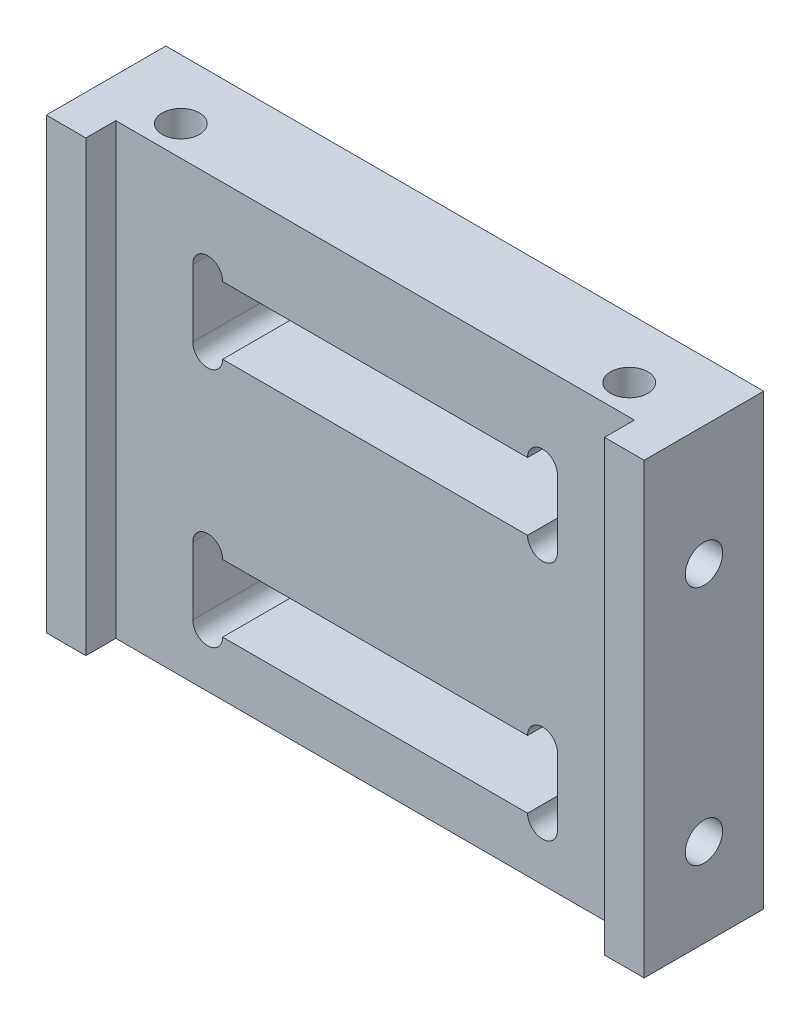
ISO-10303-21;
HEADER;
FILE_DESCRIPTION(('STEP AP214'),'2;1');
FILE_NAME('part.step','',(''),(''),'','','');
FILE_SCHEMA(('AUTOMOTIVE_DESIGN { 1 0 10303 214 1 1 1 1 }'));
ENDSEC;
DATA;
#1=APPLICATION_CONTEXT('core data for automotive mechanical design processes');
#2=APPLICATION_PROTOCOL_DEFINITION('international standard','automotive_design',2000,#1);
#3=PRODUCT_CONTEXT('',#1,'mechanical');
#4=PRODUCT('Part','Part','',(#3));
#5=PRODUCT_RELATED_PRODUCT_CATEGORY('part','',(#4));
#6=PRODUCT_DEFINITION_FORMATION('','',#4);
#7=PRODUCT_DEFINITION_CONTEXT('part definition',#1,'design');
#8=PRODUCT_DEFINITION('design','',#6,#7);
#9=PRODUCT_DEFINITION_SHAPE('','',#8);
#10=(LENGTH_UNIT() NAMED_UNIT(*) SI_UNIT(.MILLI.,.METRE.));
#11=(NAMED_UNIT(*) PLANE_ANGLE_UNIT() SI_UNIT($,.RADIAN.));
#12=(NAMED_UNIT(*) SI_UNIT($,.STERADIAN.) SOLID_ANGLE_UNIT());
#13=UNCERTAINTY_MEASURE_WITH_UNIT(LENGTH_MEASURE(1.E-05),#10,'distance_accuracy_value','');
#14=(GEOMETRIC_REPRESENTATION_CONTEXT(3) GLOBAL_UNCERTAINTY_ASSIGNED_CONTEXT((#13)) GLOBAL_UNIT_ASSIGNED_CONTEXT((#10,
#11,#12)) REPRESENTATION_CONTEXT('',''));
#15=CARTESIAN_POINT('',(0.,0.,0.));
#16=DIRECTION('',(0.,0.,1.));
#17=DIRECTION('',(1.,0.,0.));
#18=AXIS2_PLACEMENT_3D('',#15,#16,#17);
#19=CARTESIAN_POINT('',(0.,0.,4.));
#20=DIRECTION('',(0.,0.,1.));
#21=DIRECTION('',(1.,0.,0.));
#22=AXIS2_PLACEMENT_3D('',#19,#20,#21);
#23=PLANE('',#22);
#24=DIRECTION('',(0.,1.,0.));
#25=VECTOR('',#24,1.);
#26=CARTESIAN_POINT('',(17.35,19.75,4.));
#27=LINE('',#26,#25);
#28=CARTESIAN_POINT('',(17.35,-15.,4.));
#29=VERTEX_POINT('',#28);
#30=CARTESIAN_POINT('',(17.35,15.,4.));
#31=VERTEX_POINT('',#30);
#32=EDGE_CURVE('E374',#29,#31,#27,.T.);
#33=ORIENTED_EDGE('',*,*,#32,.F.);
#34=DIRECTION('',(1.,0.,0.));
#35=VECTOR('',#34,1.);
#36=CARTESIAN_POINT('',(20.,-15.,4.));
#37=LINE('',#36,#35);
#38=CARTESIAN_POINT('',(20.,-15.,4.));
#39=VERTEX_POINT('',#38);
#40=EDGE_CURVE('E513',#29,#39,#37,.T.);
#41=ORIENTED_EDGE('',*,*,#40,.T.);
#42=DIRECTION('',(0.,1.,0.));
#43=VECTOR('',#42,1.);
#44=CARTESIAN_POINT('',(20.,-15.,4.));
#45=LINE('',#44,#43);
#46=CARTESIAN_POINT('',(20.,15.,4.));
#47=VERTEX_POINT('',#46);
#48=EDGE_CURVE('E519',#39,#47,#45,.T.);
#49=ORIENTED_EDGE('',*,*,#48,.T.);
#50=DIRECTION('',(-1.,0.,0.));
#51=VECTOR('',#50,1.);
#52=CARTESIAN_POINT('',(20.,15.,4.));
#53=LINE('',#52,#51);
#54=EDGE_CURVE('E523',#47,#31,#53,.T.);
#55=ORIENTED_EDGE('',*,*,#54,.T.);
#56=EDGE_LOOP('',(#33,#41,#49,#55));
#57=FACE_BOUND('',#56,.T.);
#58=ADVANCED_FACE('F49',(#57),#23,.T.);
#59=CARTESIAN_POINT('',(-20.,-15.,4.));
#60=DIRECTION('',(1.,0.,0.));
#61=DIRECTION('',(0.,0.,-1.));
#62=AXIS2_PLACEMENT_3D('',#59,#60,#61);
#63=PLANE('',#62);
#64=CARTESIAN_POINT('',(-20.,6.99999999999999,0.));
#65=DIRECTION('',(-1.,0.,0.));
#66=DIRECTION('',(0.,0.,1.));
#67=AXIS2_PLACEMENT_3D('',#64,#65,#66);
#68=CIRCLE('',#67,1.25);
#69=CARTESIAN_POINT('',(-20.,6.99999999999999,1.25));
#70=VERTEX_POINT('',#69);
#71=EDGE_CURVE('E259',#70,#70,#68,.T.);
#72=ORIENTED_EDGE('',*,*,#71,.F.);
#73=EDGE_LOOP('',(#72));
#74=FACE_BOUND('',#73,.T.);
#75=CARTESIAN_POINT('',(-20.,-9.1,0.));
#76=DIRECTION('',(-1.,0.,0.));
#77=DIRECTION('',(0.,0.,1.));
#78=AXIS2_PLACEMENT_3D('',#75,#76,#77);
#79=CIRCLE('',#78,1.25);
#80=CARTESIAN_POINT('',(-20.,-9.1,1.25));
#81=VERTEX_POINT('',#80);
#82=EDGE_CURVE('E267',#81,#81,#79,.T.);
#83=ORIENTED_EDGE('',*,*,#82,.F.);
#84=EDGE_LOOP('',(#83));
#85=FACE_BOUND('',#84,.T.);
#86=DIRECTION('',(0.,-1.,0.));
#87=VECTOR('',#86,1.);
#88=CARTESIAN_POINT('',(-20.,-15.,-4.));
#89=LINE('',#88,#87);
#90=CARTESIAN_POINT('',(-20.,15.,-4.));
#91=VERTEX_POINT('',#90);
#92=CARTESIAN_POINT('',(-20.,-15.,-4.));
#93=VERTEX_POINT('',#92);
#94=EDGE_CURVE('E508',#91,#93,#89,.T.);
#95=ORIENTED_EDGE('',*,*,#94,.T.);
#96=DIRECTION('',(0.,0.,-1.));
#97=VECTOR('',#96,1.);
#98=CARTESIAN_POINT('',(-20.,-15.,4.));
#99=LINE('',#98,#97);
#100=CARTESIAN_POINT('',(-20.,-15.,4.));
#101=VERTEX_POINT('',#100);
#102=EDGE_CURVE('E550',#101,#93,#99,.T.);
#103=ORIENTED_EDGE('',*,*,#102,.F.);
#104=DIRECTION('',(0.,-1.,0.));
#105=VECTOR('',#104,1.);
#106=CARTESIAN_POINT('',(-20.,-15.,4.));
#107=LINE('',#106,#105);
#108=CARTESIAN_POINT('',(-20.,15.,4.));
#109=VERTEX_POINT('',#108);
#110=EDGE_CURVE('E509',#109,#101,#107,.T.);
#111=ORIENTED_EDGE('',*,*,#110,.F.);
#112=DIRECTION('',(0.,0.,-1.));
#113=VECTOR('',#112,1.);
#114=CARTESIAN_POINT('',(-20.,15.,4.));
#115=LINE('',#114,#113);
#116=EDGE_CURVE('E527',#109,#91,#115,.T.);
#117=ORIENTED_EDGE('',*,*,#116,.T.);
#118=EDGE_LOOP('',(#95,#103,#111,#117));
#119=FACE_BOUND('',#118,.T.);
#120=ADVANCED_FACE('F51',(#74,#85,#119),#63,.F.);
#121=CARTESIAN_POINT('',(20.,-15.,4.));
#122=DIRECTION('',(0.,1.,0.));
#123=DIRECTION('',(-1.,0.,0.));
#124=AXIS2_PLACEMENT_3D('',#121,#122,#123);
#125=PLANE('',#124);
#126=CARTESIAN_POINT('',(14.5,-15.,0.));
#127=DIRECTION('',(0.,-1.,0.));
#128=DIRECTION('',(0.,0.,-1.));
#129=AXIS2_PLACEMENT_3D('',#126,#127,#128);
#130=CIRCLE('',#129,1.25);
#131=CARTESIAN_POINT('',(14.5,-15.,-1.25));
#132=VERTEX_POINT('',#131);
#133=EDGE_CURVE('E291',#132,#132,#130,.T.);
#134=ORIENTED_EDGE('',*,*,#133,.F.);
#135=EDGE_LOOP('',(#134));
#136=FACE_BOUND('',#135,.T.);
#137=CARTESIAN_POINT('',(-14.5,-15.,0.));
#138=DIRECTION('',(0.,-1.,0.));
#139=DIRECTION('',(0.,0.,-1.));
#140=AXIS2_PLACEMENT_3D('',#137,#138,#139);
#141=CIRCLE('',#140,1.25);
#142=CARTESIAN_POINT('',(-14.5,-15.,-1.25));
#143=VERTEX_POINT('',#142);
#144=EDGE_CURVE('E299',#143,#143,#141,.T.);
#145=ORIENTED_EDGE('',*,*,#144,.F.);
#146=EDGE_LOOP('',(#145));
#147=FACE_BOUND('',#146,.T.);
#148=ORIENTED_EDGE('',*,*,#40,.F.);
#149=DIRECTION('',(0.,0.,1.));
#150=VECTOR('',#149,1.);
#151=CARTESIAN_POINT('',(17.35,-15.,2.));
#152=LINE('',#151,#150);
#153=CARTESIAN_POINT('',(17.35,-15.,2.));
#154=VERTEX_POINT('',#153);
#155=EDGE_CURVE('E494',#154,#29,#152,.T.);
#156=ORIENTED_EDGE('',*,*,#155,.F.);
#157=DIRECTION('',(1.,0.,0.));
#158=VECTOR('',#157,1.);
#159=CARTESIAN_POINT('',(-17.35,-15.,2.));
#160=LINE('',#159,#158);
#161=CARTESIAN_POINT('',(-17.35,-15.,2.));
#162=VERTEX_POINT('',#161);
#163=EDGE_CURVE('E483',#162,#154,#160,.T.);
#164=ORIENTED_EDGE('',*,*,#163,.F.);
#165=DIRECTION('',(0.,0.,1.));
#166=VECTOR('',#165,1.);
#167=CARTESIAN_POINT('',(-17.35,-15.,2.));
#168=LINE('',#167,#166);
#169=CARTESIAN_POINT('',(-17.35,-15.,4.));
#170=VERTEX_POINT('',#169);
#171=EDGE_CURVE('E491',#162,#170,#168,.T.);
#172=ORIENTED_EDGE('',*,*,#171,.T.);
#173=EDGE_CURVE('E515',#101,#170,#37,.T.);
#174=ORIENTED_EDGE('',*,*,#173,.F.);
#175=ORIENTED_EDGE('',*,*,#102,.T.);
#176=DIRECTION('',(1.,0.,0.));
#177=VECTOR('',#176,1.);
#178=CARTESIAN_POINT('',(20.,-15.,-4.));
#179=LINE('',#178,#177);
#180=CARTESIAN_POINT('',(20.,-15.,-4.));
#181=VERTEX_POINT('',#180);
#182=EDGE_CURVE('E531',#93,#181,#179,.T.);
#183=ORIENTED_EDGE('',*,*,#182,.T.);
#184=DIRECTION('',(0.,0.,-1.));
#185=VECTOR('',#184,1.);
#186=CARTESIAN_POINT('',(20.,-15.,4.));
#187=LINE('',#186,#185);
#188=EDGE_CURVE('E546',#39,#181,#187,.T.);
#189=ORIENTED_EDGE('',*,*,#188,.F.);
#190=EDGE_LOOP('',(#148,#156,#164,#172,#174,#175,#183,#189));
#191=FACE_BOUND('',#190,.T.);
#192=ADVANCED_FACE('F565',(#136,#147,#191),#125,.F.);
#193=CARTESIAN_POINT('',(20.,-15.,4.));
#194=DIRECTION('',(-1.,0.,0.));
#195=DIRECTION('',(0.,0.,1.));
#196=AXIS2_PLACEMENT_3D('',#193,#194,#195);
#197=PLANE('',#196);
#198=CARTESIAN_POINT('',(20.,6.99999999999999,0.));
#199=DIRECTION('',(1.,0.,0.));
#200=DIRECTION('',(0.,0.,-1.));
#201=AXIS2_PLACEMENT_3D('',#198,#199,#200);
#202=CIRCLE('',#201,1.25);
#203=CARTESIAN_POINT('',(20.,6.99999999999999,-1.25));
#204=VERTEX_POINT('',#203);
#205=EDGE_CURVE('E275',#204,#204,#202,.T.);
#206=ORIENTED_EDGE('',*,*,#205,.F.);
#207=EDGE_LOOP('',(#206));
#208=FACE_BOUND('',#207,.T.);
#209=CARTESIAN_POINT('',(20.,-9.1,0.));
#210=DIRECTION('',(1.,0.,0.));
#211=DIRECTION('',(0.,0.,-1.));
#212=AXIS2_PLACEMENT_3D('',#209,#210,#211);
#213=CIRCLE('',#212,1.25);
#214=CARTESIAN_POINT('',(20.,-9.1,-1.25));
#215=VERTEX_POINT('',#214);
#216=EDGE_CURVE('E283',#215,#215,#213,.T.);
#217=ORIENTED_EDGE('',*,*,#216,.F.);
#218=EDGE_LOOP('',(#217));
#219=FACE_BOUND('',#218,.T.);
#220=DIRECTION('',(0.,1.,0.));
#221=VECTOR('',#220,1.);
#222=CARTESIAN_POINT('',(20.,-15.,-4.));
#223=LINE('',#222,#221);
#224=CARTESIAN_POINT('',(20.,15.,-4.));
#225=VERTEX_POINT('',#224);
#226=EDGE_CURVE('E534',#181,#225,#223,.T.);
#227=ORIENTED_EDGE('',*,*,#226,.T.);
#228=DIRECTION('',(0.,0.,-1.));
#229=VECTOR('',#228,1.);
#230=CARTESIAN_POINT('',(20.,15.,4.));
#231=LINE('',#230,#229);
#232=EDGE_CURVE('E542',#47,#225,#231,.T.);
#233=ORIENTED_EDGE('',*,*,#232,.F.);
#234=ORIENTED_EDGE('',*,*,#48,.F.);
#235=ORIENTED_EDGE('',*,*,#188,.T.);
#236=EDGE_LOOP('',(#227,#233,#234,#235));
#237=FACE_BOUND('',#236,.T.);
#238=ADVANCED_FACE('F578',(#208,#219,#237),#197,.F.);
#239=CARTESIAN_POINT('',(20.,15.,4.));
#240=DIRECTION('',(0.,-1.,0.));
#241=DIRECTION('',(1.,0.,0.));
#242=AXIS2_PLACEMENT_3D('',#239,#240,#241);
#243=PLANE('',#242);
#244=CARTESIAN_POINT('',(-15.,15.,0.));
#245=DIRECTION('',(0.,1.,0.));
#246=DIRECTION('',(0.,0.,1.));
#247=AXIS2_PLACEMENT_3D('',#244,#245,#246);
#248=CIRCLE('',#247,1.24999999999999);
#249=CARTESIAN_POINT('',(-15.,15.,1.24999999999999));
#250=VERTEX_POINT('',#249);
#251=EDGE_CURVE('E245',#250,#250,#248,.T.);
#252=ORIENTED_EDGE('',*,*,#251,.F.);
#253=EDGE_LOOP('',(#252));
#254=FACE_BOUND('',#253,.T.);
#255=CARTESIAN_POINT('',(15.,15.,0.));
#256=DIRECTION('',(0.,1.,0.));
#257=DIRECTION('',(0.,0.,1.));
#258=AXIS2_PLACEMENT_3D('',#255,#256,#257);
#259=CIRCLE('',#258,1.24999999999999);
#260=CARTESIAN_POINT('',(15.,15.,1.24999999999999));
#261=VERTEX_POINT('',#260);
#262=EDGE_CURVE('E244',#261,#261,#259,.T.);
#263=ORIENTED_EDGE('',*,*,#262,.F.);
#264=EDGE_LOOP('',(#263));
#265=FACE_BOUND('',#264,.T.);
#266=DIRECTION('',(1.,0.,0.));
#267=VECTOR('',#266,1.);
#268=CARTESIAN_POINT('',(20.,15.,2.));
#269=LINE('',#268,#267);
#270=CARTESIAN_POINT('',(-17.35,15.,2.));
#271=VERTEX_POINT('',#270);
#272=CARTESIAN_POINT('',(17.35,15.,2.));
#273=VERTEX_POINT('',#272);
#274=EDGE_CURVE('E11',#271,#273,#269,.T.);
#275=ORIENTED_EDGE('',*,*,#274,.T.);
#276=DIRECTION('',(0.,0.,1.));
#277=VECTOR('',#276,1.);
#278=CARTESIAN_POINT('',(17.35,15.,4.));
#279=LINE('',#278,#277);
#280=EDGE_CURVE('E504',#273,#31,#279,.T.);
#281=ORIENTED_EDGE('',*,*,#280,.T.);
#282=ORIENTED_EDGE('',*,*,#54,.F.);
#283=ORIENTED_EDGE('',*,*,#232,.T.);
#284=DIRECTION('',(-1.,0.,0.));
#285=VECTOR('',#284,1.);
#286=CARTESIAN_POINT('',(20.,15.,-4.));
#287=LINE('',#286,#285);
#288=EDGE_CURVE('E514',#225,#91,#287,.T.);
#289=ORIENTED_EDGE('',*,*,#288,.T.);
#290=ORIENTED_EDGE('',*,*,#116,.F.);
#291=CARTESIAN_POINT('',(-17.35,15.,4.));
#292=VERTEX_POINT('',#291);
#293=EDGE_CURVE('E522',#292,#109,#53,.T.);
#294=ORIENTED_EDGE('',*,*,#293,.F.);
#295=DIRECTION('',(0.,0.,-1.));
#296=VECTOR('',#295,1.);
#297=CARTESIAN_POINT('',(-17.35,15.,4.));
#298=LINE('',#297,#296);
#299=EDGE_CURVE('E497',#292,#271,#298,.T.);
#300=ORIENTED_EDGE('',*,*,#299,.T.);
#301=EDGE_LOOP('',(#275,#281,#282,#283,#289,#290,#294,#300));
#302=FACE_BOUND('',#301,.T.);
#303=ADVANCED_FACE('F583',(#254,#265,#302),#243,.F.);
#304=DIRECTION('',(0.,-1.,0.));
#305=VECTOR('',#304,1.);
#306=CARTESIAN_POINT('',(-17.35,0.,4.));
#307=LINE('',#306,#305);
#308=EDGE_CURVE('E58',#292,#170,#307,.T.);
#309=ORIENTED_EDGE('',*,*,#308,.F.);
#310=ORIENTED_EDGE('',*,*,#293,.T.);
#311=ORIENTED_EDGE('',*,*,#110,.T.);
#312=ORIENTED_EDGE('',*,*,#173,.T.);
#313=EDGE_LOOP('',(#309,#310,#311,#312));
#314=FACE_BOUND('',#313,.T.);
#315=ADVANCED_FACE('F567',(#314),#23,.T.);
#316=CARTESIAN_POINT('',(0.,0.,-4.));
#317=DIRECTION('',(0.,0.,1.));
#318=DIRECTION('',(1.,0.,0.));
#319=AXIS2_PLACEMENT_3D('',#316,#317,#318);
#320=PLANE('',#319);
#321=DIRECTION('',(0.,1.,0.));
#322=VECTOR('',#321,1.);
#323=CARTESIAN_POINT('',(12.2,-6.85,-4.));
#324=LINE('',#323,#322);
#325=CARTESIAN_POINT('',(12.2,-11.35,-4.));
#326=VERTEX_POINT('',#325);
#327=CARTESIAN_POINT('',(12.2,-6.85,-4.));
#328=VERTEX_POINT('',#327);
#329=EDGE_CURVE('E335',#326,#328,#324,.T.);
#330=ORIENTED_EDGE('',*,*,#329,.T.);
#331=CARTESIAN_POINT('',(11.2,-6.85,-4.));
#332=DIRECTION('',(0.,0.,1.));
#333=DIRECTION('',(1.,0.,0.));
#334=AXIS2_PLACEMENT_3D('',#331,#332,#333);
#335=CIRCLE('',#334,0.999999999999997);
#336=CARTESIAN_POINT('',(10.2,-6.85,-4.));
#337=VERTEX_POINT('',#336);
#338=EDGE_CURVE('E308',#328,#337,#335,.T.);
#339=ORIENTED_EDGE('',*,*,#338,.T.);
#340=DIRECTION('',(-1.,0.,0.));
#341=VECTOR('',#340,1.);
#342=CARTESIAN_POINT('',(-10.2,-6.85,-4.));
#343=LINE('',#342,#341);
#344=CARTESIAN_POINT('',(-10.2,-6.85,-4.));
#345=VERTEX_POINT('',#344);
#346=EDGE_CURVE('E312',#337,#345,#343,.T.);
#347=ORIENTED_EDGE('',*,*,#346,.T.);
#348=CARTESIAN_POINT('',(-11.2,-6.85,-4.));
#349=DIRECTION('',(0.,0.,1.));
#350=DIRECTION('',(-1.,0.,0.));
#351=AXIS2_PLACEMENT_3D('',#348,#349,#350);
#352=CIRCLE('',#351,1.);
#353=CARTESIAN_POINT('',(-12.2,-6.85,-4.));
#354=VERTEX_POINT('',#353);
#355=EDGE_CURVE('E65',#345,#354,#352,.T.);
#356=ORIENTED_EDGE('',*,*,#355,.T.);
#357=DIRECTION('',(0.,-1.,0.));
#358=VECTOR('',#357,1.);
#359=CARTESIAN_POINT('',(-12.2,-11.35,-4.));
#360=LINE('',#359,#358);
#361=CARTESIAN_POINT('',(-12.2,-11.35,-4.));
#362=VERTEX_POINT('',#361);
#363=EDGE_CURVE('E319',#354,#362,#360,.T.);
#364=ORIENTED_EDGE('',*,*,#363,.T.);
#365=CARTESIAN_POINT('',(-11.2,-11.35,-4.));
#366=DIRECTION('',(0.,0.,1.));
#367=DIRECTION('',(1.,0.,0.));
#368=AXIS2_PLACEMENT_3D('',#365,#366,#367);
#369=CIRCLE('',#368,1.);
#370=CARTESIAN_POINT('',(-10.2,-11.35,-4.));
#371=VERTEX_POINT('',#370);
#372=EDGE_CURVE('E323',#362,#371,#369,.T.);
#373=ORIENTED_EDGE('',*,*,#372,.T.);
#374=DIRECTION('',(1.,0.,0.));
#375=VECTOR('',#374,1.);
#376=CARTESIAN_POINT('',(10.2,-11.35,-4.));
#377=LINE('',#376,#375);
#378=CARTESIAN_POINT('',(10.2,-11.35,-4.));
#379=VERTEX_POINT('',#378);
#380=EDGE_CURVE('E327',#371,#379,#377,.T.);
#381=ORIENTED_EDGE('',*,*,#380,.T.);
#382=CARTESIAN_POINT('',(11.2,-11.35,-4.));
#383=DIRECTION('',(0.,0.,1.));
#384=DIRECTION('',(1.,0.,0.));
#385=AXIS2_PLACEMENT_3D('',#382,#383,#384);
#386=CIRCLE('',#385,0.999999999999999);
#387=EDGE_CURVE('E331',#379,#326,#386,.T.);
#388=ORIENTED_EDGE('',*,*,#387,.T.);
#389=EDGE_LOOP('',(#330,#339,#347,#356,#364,#373,#381,#388));
#390=FACE_BOUND('',#389,.T.);
#391=DIRECTION('',(0.,1.,0.));
#392=VECTOR('',#391,1.);
#393=CARTESIAN_POINT('',(12.2,9.25,-4.));
#394=LINE('',#393,#392);
#395=CARTESIAN_POINT('',(12.2,4.75,-4.));
#396=VERTEX_POINT('',#395);
#397=CARTESIAN_POINT('',(12.2,9.25,-4.));
#398=VERTEX_POINT('',#397);
#399=EDGE_CURVE('E400',#396,#398,#394,.T.);
#400=ORIENTED_EDGE('',*,*,#399,.T.);
#401=CARTESIAN_POINT('',(11.2,9.25,-4.));
#402=DIRECTION('',(0.,0.,1.));
#403=DIRECTION('',(1.,0.,0.));
#404=AXIS2_PLACEMENT_3D('',#401,#402,#403);
#405=CIRCLE('',#404,1.);
#406=CARTESIAN_POINT('',(10.2,9.24999999999999,-4.));
#407=VERTEX_POINT('',#406);
#408=EDGE_CURVE('E426',#398,#407,#405,.T.);
#409=ORIENTED_EDGE('',*,*,#408,.T.);
#410=DIRECTION('',(-1.,0.,0.));
#411=VECTOR('',#410,1.);
#412=CARTESIAN_POINT('',(-10.2,9.25,-4.));
#413=LINE('',#412,#411);
#414=CARTESIAN_POINT('',(-10.2,9.25,-4.));
#415=VERTEX_POINT('',#414);
#416=EDGE_CURVE('E473',#407,#415,#413,.T.);
#417=ORIENTED_EDGE('',*,*,#416,.T.);
#418=CARTESIAN_POINT('',(-11.2,9.25,-4.));
#419=DIRECTION('',(0.,0.,1.));
#420=DIRECTION('',(-1.,0.,0.));
#421=AXIS2_PLACEMENT_3D('',#418,#419,#420);
#422=CIRCLE('',#421,1.);
#423=CARTESIAN_POINT('',(-12.2,9.25,-4.));
#424=VERTEX_POINT('',#423);
#425=EDGE_CURVE('E73',#415,#424,#422,.T.);
#426=ORIENTED_EDGE('',*,*,#425,.T.);
#427=DIRECTION('',(0.,-1.,0.));
#428=VECTOR('',#427,1.);
#429=CARTESIAN_POINT('',(-12.2,4.75,-4.));
#430=LINE('',#429,#428);
#431=CARTESIAN_POINT('',(-12.2,4.75,-4.));
#432=VERTEX_POINT('',#431);
#433=EDGE_CURVE('E467',#424,#432,#430,.T.);
#434=ORIENTED_EDGE('',*,*,#433,.T.);
#435=CARTESIAN_POINT('',(-11.2,4.75,-4.));
#436=DIRECTION('',(0.,0.,1.));
#437=DIRECTION('',(1.,0.,0.));
#438=AXIS2_PLACEMENT_3D('',#435,#436,#437);
#439=CIRCLE('',#438,1.);
#440=CARTESIAN_POINT('',(-10.2,4.75,-4.));
#441=VERTEX_POINT('',#440);
#442=EDGE_CURVE('E463',#432,#441,#439,.T.);
#443=ORIENTED_EDGE('',*,*,#442,.T.);
#444=DIRECTION('',(1.,0.,0.));
#445=VECTOR('',#444,1.);
#446=CARTESIAN_POINT('',(10.2,4.75,-4.));
#447=LINE('',#446,#445);
#448=CARTESIAN_POINT('',(10.2,4.75,-4.));
#449=VERTEX_POINT('',#448);
#450=EDGE_CURVE('E459',#441,#449,#447,.T.);
#451=ORIENTED_EDGE('',*,*,#450,.T.);
#452=CARTESIAN_POINT('',(11.2,4.75,-4.));
#453=DIRECTION('',(0.,0.,1.));
#454=DIRECTION('',(1.,0.,0.));
#455=AXIS2_PLACEMENT_3D('',#452,#453,#454);
#456=CIRCLE('',#455,1.);
#457=EDGE_CURVE('E455',#449,#396,#456,.T.);
#458=ORIENTED_EDGE('',*,*,#457,.T.);
#459=EDGE_LOOP('',(#400,#409,#417,#426,#434,#443,#451,#458));
#460=FACE_BOUND('',#459,.T.);
#461=ORIENTED_EDGE('',*,*,#94,.F.);
#462=ORIENTED_EDGE('',*,*,#288,.F.);
#463=ORIENTED_EDGE('',*,*,#226,.F.);
#464=ORIENTED_EDGE('',*,*,#182,.F.);
#465=EDGE_LOOP('',(#461,#462,#463,#464));
#466=FACE_BOUND('',#465,.T.);
#467=ADVANCED_FACE('F581',(#390,#460,#466),#320,.F.);
#468=CARTESIAN_POINT('',(15.85,19.75,2.));
#469=DIRECTION('',(0.,0.,-1.));
#470=DIRECTION('',(-1.,0.,0.));
#471=AXIS2_PLACEMENT_3D('',#468,#469,#470);
#472=PLANE('',#471);
#473=DIRECTION('',(-1.,0.,0.));
#474=VECTOR('',#473,1.);
#475=CARTESIAN_POINT('',(-10.2,-6.85,2.));
#476=LINE('',#475,#474);
#477=CARTESIAN_POINT('',(10.2,-6.85,2.));
#478=VERTEX_POINT('',#477);
#479=CARTESIAN_POINT('',(-10.2,-6.85,2.));
#480=VERTEX_POINT('',#479);
#481=EDGE_CURVE('E343',#478,#480,#476,.T.);
#482=ORIENTED_EDGE('',*,*,#481,.F.);
#483=CARTESIAN_POINT('',(11.2,-6.85,2.));
#484=DIRECTION('',(0.,0.,1.));
#485=DIRECTION('',(1.,0.,0.));
#486=AXIS2_PLACEMENT_3D('',#483,#484,#485);
#487=CIRCLE('',#486,0.999999999999997);
#488=CARTESIAN_POINT('',(12.2,-6.85,2.));
#489=VERTEX_POINT('',#488);
#490=EDGE_CURVE('E340',#489,#478,#487,.T.);
#491=ORIENTED_EDGE('',*,*,#490,.F.);
#492=DIRECTION('',(0.,1.,0.));
#493=VECTOR('',#492,1.);
#494=CARTESIAN_POINT('',(12.2,-6.85,2.));
#495=LINE('',#494,#493);
#496=CARTESIAN_POINT('',(12.2,-11.35,2.));
#497=VERTEX_POINT('',#496);
#498=EDGE_CURVE('E313',#497,#489,#495,.T.);
#499=ORIENTED_EDGE('',*,*,#498,.F.);
#500=CARTESIAN_POINT('',(11.2,-11.35,2.));
#501=DIRECTION('',(0.,0.,1.));
#502=DIRECTION('',(1.,0.,0.));
#503=AXIS2_PLACEMENT_3D('',#500,#501,#502);
#504=CIRCLE('',#503,0.999999999999999);
#505=CARTESIAN_POINT('',(10.2,-11.35,2.));
#506=VERTEX_POINT('',#505);
#507=EDGE_CURVE('E364',#506,#497,#504,.T.);
#508=ORIENTED_EDGE('',*,*,#507,.F.);
#509=DIRECTION('',(1.,0.,0.));
#510=VECTOR('',#509,1.);
#511=CARTESIAN_POINT('',(10.2,-11.35,2.));
#512=LINE('',#511,#510);
#513=CARTESIAN_POINT('',(-10.2,-11.35,2.));
#514=VERTEX_POINT('',#513);
#515=EDGE_CURVE('E360',#514,#506,#512,.T.);
#516=ORIENTED_EDGE('',*,*,#515,.F.);
#517=CARTESIAN_POINT('',(-11.2,-11.35,2.));
#518=DIRECTION('',(0.,0.,1.));
#519=DIRECTION('',(1.,0.,0.));
#520=AXIS2_PLACEMENT_3D('',#517,#518,#519);
#521=CIRCLE('',#520,1.);
#522=CARTESIAN_POINT('',(-12.2,-11.35,2.));
#523=VERTEX_POINT('',#522);
#524=EDGE_CURVE('E356',#523,#514,#521,.T.);
#525=ORIENTED_EDGE('',*,*,#524,.F.);
#526=DIRECTION('',(0.,-1.,0.));
#527=VECTOR('',#526,1.);
#528=CARTESIAN_POINT('',(-12.2,-11.35,2.));
#529=LINE('',#528,#527);
#530=CARTESIAN_POINT('',(-12.2,-6.85,2.));
#531=VERTEX_POINT('',#530);
#532=EDGE_CURVE('E352',#531,#523,#529,.T.);
#533=ORIENTED_EDGE('',*,*,#532,.F.);
#534=CARTESIAN_POINT('',(-11.2,-6.85,2.));
#535=DIRECTION('',(0.,0.,1.));
#536=DIRECTION('',(-1.,0.,0.));
#537=AXIS2_PLACEMENT_3D('',#534,#535,#536);
#538=CIRCLE('',#537,1.);
#539=EDGE_CURVE('E348',#480,#531,#538,.T.);
#540=ORIENTED_EDGE('',*,*,#539,.F.);
#541=EDGE_LOOP('',(#482,#491,#499,#508,#516,#525,#533,#540));
#542=FACE_BOUND('',#541,.T.);
#543=DIRECTION('',(-1.,0.,0.));
#544=VECTOR('',#543,1.);
#545=CARTESIAN_POINT('',(-10.2,9.25,2.));
#546=LINE('',#545,#544);
#547=CARTESIAN_POINT('',(10.2,9.24999999999999,2.));
#548=VERTEX_POINT('',#547);
#549=CARTESIAN_POINT('',(-10.2,9.25,2.));
#550=VERTEX_POINT('',#549);
#551=EDGE_CURVE('E446',#548,#550,#546,.T.);
#552=ORIENTED_EDGE('',*,*,#551,.F.);
#553=CARTESIAN_POINT('',(11.2,9.25,2.));
#554=DIRECTION('',(0.,0.,1.));
#555=DIRECTION('',(1.,0.,0.));
#556=AXIS2_PLACEMENT_3D('',#553,#554,#555);
#557=CIRCLE('',#556,1.);
#558=CARTESIAN_POINT('',(12.2,9.25,2.));
#559=VERTEX_POINT('',#558);
#560=EDGE_CURVE('E344',#559,#548,#557,.T.);
#561=ORIENTED_EDGE('',*,*,#560,.F.);
#562=DIRECTION('',(0.,1.,0.));
#563=VECTOR('',#562,1.);
#564=CARTESIAN_POINT('',(12.2,9.25,2.));
#565=LINE('',#564,#563);
#566=CARTESIAN_POINT('',(12.2,4.75,2.));
#567=VERTEX_POINT('',#566);
#568=EDGE_CURVE('E421',#567,#559,#565,.T.);
#569=ORIENTED_EDGE('',*,*,#568,.F.);
#570=CARTESIAN_POINT('',(11.2,4.75,2.));
#571=DIRECTION('',(0.,0.,1.));
#572=DIRECTION('',(1.,0.,0.));
#573=AXIS2_PLACEMENT_3D('',#570,#571,#572);
#574=CIRCLE('',#573,1.);
#575=CARTESIAN_POINT('',(10.2,4.75,2.));
#576=VERTEX_POINT('',#575);
#577=EDGE_CURVE('E425',#576,#567,#574,.T.);
#578=ORIENTED_EDGE('',*,*,#577,.F.);
#579=DIRECTION('',(1.,0.,0.));
#580=VECTOR('',#579,1.);
#581=CARTESIAN_POINT('',(10.2,4.75,2.));
#582=LINE('',#581,#580);
#583=CARTESIAN_POINT('',(-10.2,4.75,2.));
#584=VERTEX_POINT('',#583);
#585=EDGE_CURVE('E430',#584,#576,#582,.T.);
#586=ORIENTED_EDGE('',*,*,#585,.F.);
#587=CARTESIAN_POINT('',(-11.2,4.75,2.));
#588=DIRECTION('',(0.,0.,1.));
#589=DIRECTION('',(1.,0.,0.));
#590=AXIS2_PLACEMENT_3D('',#587,#588,#589);
#591=CIRCLE('',#590,1.);
#592=CARTESIAN_POINT('',(-12.2,4.75,2.));
#593=VERTEX_POINT('',#592);
#594=EDGE_CURVE('E434',#593,#584,#591,.T.);
#595=ORIENTED_EDGE('',*,*,#594,.F.);
#596=DIRECTION('',(0.,-1.,0.));
#597=VECTOR('',#596,1.);
#598=CARTESIAN_POINT('',(-12.2,4.75,2.));
#599=LINE('',#598,#597);
#600=CARTESIAN_POINT('',(-12.2,9.25,2.));
#601=VERTEX_POINT('',#600);
#602=EDGE_CURVE('E438',#601,#593,#599,.T.);
#603=ORIENTED_EDGE('',*,*,#602,.F.);
#604=CARTESIAN_POINT('',(-11.2,9.25,2.));
#605=DIRECTION('',(0.,0.,1.));
#606=DIRECTION('',(-1.,0.,0.));
#607=AXIS2_PLACEMENT_3D('',#604,#605,#606);
#608=CIRCLE('',#607,1.);
#609=EDGE_CURVE('E442',#550,#601,#608,.T.);
#610=ORIENTED_EDGE('',*,*,#609,.F.);
#611=EDGE_LOOP('',(#552,#561,#569,#578,#586,#595,#603,#610));
#612=FACE_BOUND('',#611,.T.);
#613=DIRECTION('',(0.,-1.,0.));
#614=VECTOR('',#613,1.);
#615=CARTESIAN_POINT('',(-17.35,19.75,2.));
#616=LINE('',#615,#614);
#617=EDGE_CURVE('E480',#271,#162,#616,.T.);
#618=ORIENTED_EDGE('',*,*,#617,.T.);
#619=ORIENTED_EDGE('',*,*,#163,.T.);
#620=DIRECTION('',(0.,1.,0.));
#621=VECTOR('',#620,1.);
#622=CARTESIAN_POINT('',(17.35,-15.,2.));
#623=LINE('',#622,#621);
#624=EDGE_CURVE('E487',#154,#273,#623,.T.);
#625=ORIENTED_EDGE('',*,*,#624,.T.);
#626=ORIENTED_EDGE('',*,*,#274,.F.);
#627=EDGE_LOOP('',(#618,#619,#625,#626));
#628=FACE_BOUND('',#627,.T.);
#629=ADVANCED_FACE('F616',(#542,#612,#628),#472,.F.);
#630=CARTESIAN_POINT('',(17.35,19.75,2.));
#631=DIRECTION('',(1.,0.,0.));
#632=DIRECTION('',(0.,0.,-1.));
#633=AXIS2_PLACEMENT_3D('',#630,#631,#632);
#634=PLANE('',#633);
#635=ORIENTED_EDGE('',*,*,#624,.F.);
#636=ORIENTED_EDGE('',*,*,#155,.T.);
#637=ORIENTED_EDGE('',*,*,#32,.T.);
#638=ORIENTED_EDGE('',*,*,#280,.F.);
#639=EDGE_LOOP('',(#635,#636,#637,#638));
#640=FACE_BOUND('',#639,.T.);
#641=ADVANCED_FACE('F614',(#640),#634,.F.);
#642=CARTESIAN_POINT('',(-17.35,-13.2,2.));
#643=DIRECTION('',(-1.,0.,0.));
#644=DIRECTION('',(0.,0.,1.));
#645=AXIS2_PLACEMENT_3D('',#642,#643,#644);
#646=PLANE('',#645);
#647=ORIENTED_EDGE('',*,*,#308,.T.);
#648=ORIENTED_EDGE('',*,*,#171,.F.);
#649=ORIENTED_EDGE('',*,*,#617,.F.);
#650=ORIENTED_EDGE('',*,*,#299,.F.);
#651=EDGE_LOOP('',(#647,#648,#649,#650));
#652=FACE_BOUND('',#651,.T.);
#653=ADVANCED_FACE('F558',(#652),#646,.F.);
#654=CARTESIAN_POINT('',(11.2,9.25,-4.));
#655=DIRECTION('',(0.,0.,1.));
#656=DIRECTION('',(1.,0.,0.));
#657=AXIS2_PLACEMENT_3D('',#654,#655,#656);
#658=CYLINDRICAL_SURFACE('',#657,1.);
#659=ORIENTED_EDGE('',*,*,#560,.T.);
#660=DIRECTION('',(0.,0.,1.));
#661=VECTOR('',#660,1.);
#662=CARTESIAN_POINT('',(10.2,9.24999999999999,-4.));
#663=LINE('',#662,#661);
#664=EDGE_CURVE('E396',#407,#548,#663,.T.);
#665=ORIENTED_EDGE('',*,*,#664,.F.);
#666=ORIENTED_EDGE('',*,*,#408,.F.);
#667=DIRECTION('',(0.,0.,1.));
#668=VECTOR('',#667,1.);
#669=CARTESIAN_POINT('',(12.2,9.25,-4.));
#670=LINE('',#669,#668);
#671=EDGE_CURVE('E307',#398,#559,#670,.T.);
#672=ORIENTED_EDGE('',*,*,#671,.T.);
#673=EDGE_LOOP('',(#659,#665,#666,#672));
#674=FACE_BOUND('',#673,.T.);
#675=ADVANCED_FACE('F708',(#674),#658,.F.);
#676=CARTESIAN_POINT('',(12.2,9.25,-4.));
#677=DIRECTION('',(1.,0.,0.));
#678=DIRECTION('',(0.,0.,-1.));
#679=AXIS2_PLACEMENT_3D('',#676,#677,#678);
#680=PLANE('',#679);
#681=ORIENTED_EDGE('',*,*,#568,.T.);
#682=ORIENTED_EDGE('',*,*,#671,.F.);
#683=ORIENTED_EDGE('',*,*,#399,.F.);
#684=DIRECTION('',(0.,0.,1.));
#685=VECTOR('',#684,1.);
#686=CARTESIAN_POINT('',(12.2,4.75,-4.));
#687=LINE('',#686,#685);
#688=EDGE_CURVE('E416',#396,#567,#687,.T.);
#689=ORIENTED_EDGE('',*,*,#688,.T.);
#690=EDGE_LOOP('',(#681,#682,#683,#689));
#691=FACE_BOUND('',#690,.T.);
#692=ADVANCED_FACE('F711',(#691),#680,.F.);
#693=CARTESIAN_POINT('',(11.2,4.75,-4.));
#694=DIRECTION('',(0.,0.,1.));
#695=DIRECTION('',(1.,0.,0.));
#696=AXIS2_PLACEMENT_3D('',#693,#694,#695);
#697=CYLINDRICAL_SURFACE('',#696,1.);
#698=ORIENTED_EDGE('',*,*,#577,.T.);
#699=ORIENTED_EDGE('',*,*,#688,.F.);
#700=ORIENTED_EDGE('',*,*,#457,.F.);
#701=DIRECTION('',(0.,0.,1.));
#702=VECTOR('',#701,1.);
#703=CARTESIAN_POINT('',(10.2,4.75,-4.));
#704=LINE('',#703,#702);
#705=EDGE_CURVE('E413',#449,#576,#704,.T.);
#706=ORIENTED_EDGE('',*,*,#705,.T.);
#707=EDGE_LOOP('',(#698,#699,#700,#706));
#708=FACE_BOUND('',#707,.T.);
#709=ADVANCED_FACE('F730',(#708),#697,.F.);
#710=CARTESIAN_POINT('',(10.2,4.75,-4.));
#711=DIRECTION('',(0.,-1.,0.));
#712=DIRECTION('',(0.,0.,-1.));
#713=AXIS2_PLACEMENT_3D('',#710,#711,#712);
#714=PLANE('',#713);
#715=ORIENTED_EDGE('',*,*,#585,.T.);
#716=ORIENTED_EDGE('',*,*,#705,.F.);
#717=ORIENTED_EDGE('',*,*,#450,.F.);
#718=DIRECTION('',(0.,0.,1.));
#719=VECTOR('',#718,1.);
#720=CARTESIAN_POINT('',(-10.2,4.75,-4.));
#721=LINE('',#720,#719);
#722=EDGE_CURVE('E410',#441,#584,#721,.T.);
#723=ORIENTED_EDGE('',*,*,#722,.T.);
#724=EDGE_LOOP('',(#715,#716,#717,#723));
#725=FACE_BOUND('',#724,.T.);
#726=ADVANCED_FACE('F726',(#725),#714,.F.);
#727=CARTESIAN_POINT('',(-11.2,4.75,-4.));
#728=DIRECTION('',(0.,0.,1.));
#729=DIRECTION('',(1.,0.,0.));
#730=AXIS2_PLACEMENT_3D('',#727,#728,#729);
#731=CYLINDRICAL_SURFACE('',#730,1.);
#732=ORIENTED_EDGE('',*,*,#594,.T.);
#733=ORIENTED_EDGE('',*,*,#722,.F.);
#734=ORIENTED_EDGE('',*,*,#442,.F.);
#735=DIRECTION('',(0.,0.,1.));
#736=VECTOR('',#735,1.);
#737=CARTESIAN_POINT('',(-12.2,4.75,-4.));
#738=LINE('',#737,#736);
#739=EDGE_CURVE('E407',#432,#593,#738,.T.);
#740=ORIENTED_EDGE('',*,*,#739,.T.);
#741=EDGE_LOOP('',(#732,#733,#734,#740));
#742=FACE_BOUND('',#741,.T.);
#743=ADVANCED_FACE('F722',(#742),#731,.F.);
#744=CARTESIAN_POINT('',(-12.2,4.75,-4.));
#745=DIRECTION('',(-1.,0.,0.));
#746=DIRECTION('',(0.,0.,1.));
#747=AXIS2_PLACEMENT_3D('',#744,#745,#746);
#748=PLANE('',#747);
#749=ORIENTED_EDGE('',*,*,#602,.T.);
#750=ORIENTED_EDGE('',*,*,#739,.F.);
#751=ORIENTED_EDGE('',*,*,#433,.F.);
#752=DIRECTION('',(0.,0.,1.));
#753=VECTOR('',#752,1.);
#754=CARTESIAN_POINT('',(-12.2,9.25,-4.));
#755=LINE('',#754,#753);
#756=EDGE_CURVE('E404',#424,#601,#755,.T.);
#757=ORIENTED_EDGE('',*,*,#756,.T.);
#758=EDGE_LOOP('',(#749,#750,#751,#757));
#759=FACE_BOUND('',#758,.T.);
#760=ADVANCED_FACE('F719',(#759),#748,.F.);
#761=CARTESIAN_POINT('',(-11.2,9.25,-4.));
#762=DIRECTION('',(0.,0.,1.));
#763=DIRECTION('',(1.,0.,0.));
#764=AXIS2_PLACEMENT_3D('',#761,#762,#763);
#765=CYLINDRICAL_SURFACE('',#764,1.);
#766=ORIENTED_EDGE('',*,*,#609,.T.);
#767=ORIENTED_EDGE('',*,*,#756,.F.);
#768=ORIENTED_EDGE('',*,*,#425,.F.);
#769=DIRECTION('',(0.,0.,1.));
#770=VECTOR('',#769,1.);
#771=CARTESIAN_POINT('',(-10.2,9.25,-4.));
#772=LINE('',#771,#770);
#773=EDGE_CURVE('E401',#415,#550,#772,.T.);
#774=ORIENTED_EDGE('',*,*,#773,.T.);
#775=EDGE_LOOP('',(#766,#767,#768,#774));
#776=FACE_BOUND('',#775,.T.);
#777=ADVANCED_FACE('F715',(#776),#765,.F.);
#778=CARTESIAN_POINT('',(-10.2,9.25,-4.));
#779=DIRECTION('',(0.,1.,0.));
#780=DIRECTION('',(-1.,0.,0.));
#781=AXIS2_PLACEMENT_3D('',#778,#779,#780);
#782=PLANE('',#781);
#783=ORIENTED_EDGE('',*,*,#551,.T.);
#784=ORIENTED_EDGE('',*,*,#773,.F.);
#785=ORIENTED_EDGE('',*,*,#416,.F.);
#786=ORIENTED_EDGE('',*,*,#664,.T.);
#787=EDGE_LOOP('',(#783,#784,#785,#786));
#788=FACE_BOUND('',#787,.T.);
#789=ADVANCED_FACE('F706',(#788),#782,.F.);
#790=CARTESIAN_POINT('',(11.2,-6.85,-4.));
#791=DIRECTION('',(0.,0.,1.));
#792=DIRECTION('',(1.,0.,0.));
#793=AXIS2_PLACEMENT_3D('',#790,#791,#792);
#794=CYLINDRICAL_SURFACE('',#793,0.999999999999997);
#795=ORIENTED_EDGE('',*,*,#490,.T.);
#796=DIRECTION('',(0.,0.,1.));
#797=VECTOR('',#796,1.);
#798=CARTESIAN_POINT('',(10.2,-6.85,-4.));
#799=LINE('',#798,#797);
#800=EDGE_CURVE('E339',#337,#478,#799,.T.);
#801=ORIENTED_EDGE('',*,*,#800,.F.);
#802=ORIENTED_EDGE('',*,*,#338,.F.);
#803=DIRECTION('',(0.,0.,1.));
#804=VECTOR('',#803,1.);
#805=CARTESIAN_POINT('',(12.2,-6.85,-4.));
#806=LINE('',#805,#804);
#807=EDGE_CURVE('E371',#328,#489,#806,.T.);
#808=ORIENTED_EDGE('',*,*,#807,.T.);
#809=EDGE_LOOP('',(#795,#801,#802,#808));
#810=FACE_BOUND('',#809,.T.);
#811=ADVANCED_FACE('F681',(#810),#794,.F.);
#812=CARTESIAN_POINT('',(12.2,-6.85,-4.));
#813=DIRECTION('',(1.,0.,0.));
#814=DIRECTION('',(0.,0.,-1.));
#815=AXIS2_PLACEMENT_3D('',#812,#813,#814);
#816=PLANE('',#815);
#817=ORIENTED_EDGE('',*,*,#498,.T.);
#818=ORIENTED_EDGE('',*,*,#807,.F.);
#819=ORIENTED_EDGE('',*,*,#329,.F.);
#820=DIRECTION('',(0.,0.,1.));
#821=VECTOR('',#820,1.);
#822=CARTESIAN_POINT('',(12.2,-11.35,-4.));
#823=LINE('',#822,#821);
#824=EDGE_CURVE('E375',#326,#497,#823,.T.);
#825=ORIENTED_EDGE('',*,*,#824,.T.);
#826=EDGE_LOOP('',(#817,#818,#819,#825));
#827=FACE_BOUND('',#826,.T.);
#828=ADVANCED_FACE('F677',(#827),#816,.F.);
#829=CARTESIAN_POINT('',(11.2,-11.35,-4.));
#830=DIRECTION('',(0.,0.,1.));
#831=DIRECTION('',(1.,0.,0.));
#832=AXIS2_PLACEMENT_3D('',#829,#830,#831);
#833=CYLINDRICAL_SURFACE('',#832,0.999999999999999);
#834=ORIENTED_EDGE('',*,*,#507,.T.);
#835=ORIENTED_EDGE('',*,*,#824,.F.);
#836=ORIENTED_EDGE('',*,*,#387,.F.);
#837=DIRECTION('',(0.,0.,1.));
#838=VECTOR('',#837,1.);
#839=CARTESIAN_POINT('',(10.2,-11.35,-4.));
#840=LINE('',#839,#838);
#841=EDGE_CURVE('E378',#379,#506,#840,.T.);
#842=ORIENTED_EDGE('',*,*,#841,.T.);
#843=EDGE_LOOP('',(#834,#835,#836,#842));
#844=FACE_BOUND('',#843,.T.);
#845=ADVANCED_FACE('F680',(#844),#833,.F.);
#846=CARTESIAN_POINT('',(10.2,-11.35,-4.));
#847=DIRECTION('',(0.,-1.,0.));
#848=DIRECTION('',(0.,0.,-1.));
#849=AXIS2_PLACEMENT_3D('',#846,#847,#848);
#850=PLANE('',#849);
#851=ORIENTED_EDGE('',*,*,#515,.T.);
#852=ORIENTED_EDGE('',*,*,#841,.F.);
#853=ORIENTED_EDGE('',*,*,#380,.F.);
#854=DIRECTION('',(0.,0.,1.));
#855=VECTOR('',#854,1.);
#856=CARTESIAN_POINT('',(-10.2,-11.35,-4.));
#857=LINE('',#856,#855);
#858=EDGE_CURVE('E381',#371,#514,#857,.T.);
#859=ORIENTED_EDGE('',*,*,#858,.T.);
#860=EDGE_LOOP('',(#851,#852,#853,#859));
#861=FACE_BOUND('',#860,.T.);
#862=ADVANCED_FACE('F685',(#861),#850,.F.);
#863=CARTESIAN_POINT('',(-11.2,-11.35,-4.));
#864=DIRECTION('',(0.,0.,1.));
#865=DIRECTION('',(1.,0.,0.));
#866=AXIS2_PLACEMENT_3D('',#863,#864,#865);
#867=CYLINDRICAL_SURFACE('',#866,1.);
#868=ORIENTED_EDGE('',*,*,#524,.T.);
#869=ORIENTED_EDGE('',*,*,#858,.F.);
#870=ORIENTED_EDGE('',*,*,#372,.F.);
#871=DIRECTION('',(0.,0.,1.));
#872=VECTOR('',#871,1.);
#873=CARTESIAN_POINT('',(-12.2,-11.35,-4.));
#874=LINE('',#873,#872);
#875=EDGE_CURVE('E384',#362,#523,#874,.T.);
#876=ORIENTED_EDGE('',*,*,#875,.T.);
#877=EDGE_LOOP('',(#868,#869,#870,#876));
#878=FACE_BOUND('',#877,.T.);
#879=ADVANCED_FACE('F689',(#878),#867,.F.);
#880=CARTESIAN_POINT('',(-12.2,-11.35,-4.));
#881=DIRECTION('',(-1.,0.,0.));
#882=DIRECTION('',(0.,0.,1.));
#883=AXIS2_PLACEMENT_3D('',#880,#881,#882);
#884=PLANE('',#883);
#885=ORIENTED_EDGE('',*,*,#532,.T.);
#886=ORIENTED_EDGE('',*,*,#875,.F.);
#887=ORIENTED_EDGE('',*,*,#363,.F.);
#888=DIRECTION('',(0.,0.,1.));
#889=VECTOR('',#888,1.);
#890=CARTESIAN_POINT('',(-12.2,-6.85,-4.));
#891=LINE('',#890,#889);
#892=EDGE_CURVE('E387',#354,#531,#891,.T.);
#893=ORIENTED_EDGE('',*,*,#892,.T.);
#894=EDGE_LOOP('',(#885,#886,#887,#893));
#895=FACE_BOUND('',#894,.T.);
#896=ADVANCED_FACE('F693',(#895),#884,.F.);
#897=CARTESIAN_POINT('',(-11.2,-6.85,-4.));
#898=DIRECTION('',(0.,0.,1.));
#899=DIRECTION('',(1.,0.,0.));
#900=AXIS2_PLACEMENT_3D('',#897,#898,#899);
#901=CYLINDRICAL_SURFACE('',#900,1.);
#902=ORIENTED_EDGE('',*,*,#539,.T.);
#903=ORIENTED_EDGE('',*,*,#892,.F.);
#904=ORIENTED_EDGE('',*,*,#355,.F.);
#905=DIRECTION('',(0.,0.,1.));
#906=VECTOR('',#905,1.);
#907=CARTESIAN_POINT('',(-10.2,-6.85,-4.));
#908=LINE('',#907,#906);
#909=EDGE_CURVE('E390',#345,#480,#908,.T.);
#910=ORIENTED_EDGE('',*,*,#909,.T.);
#911=EDGE_LOOP('',(#902,#903,#904,#910));
#912=FACE_BOUND('',#911,.T.);
#913=ADVANCED_FACE('F697',(#912),#901,.F.);
#914=CARTESIAN_POINT('',(-10.2,-6.85,-4.));
#915=DIRECTION('',(0.,1.,0.));
#916=DIRECTION('',(0.,0.,1.));
#917=AXIS2_PLACEMENT_3D('',#914,#915,#916);
#918=PLANE('',#917);
#919=ORIENTED_EDGE('',*,*,#481,.T.);
#920=ORIENTED_EDGE('',*,*,#909,.F.);
#921=ORIENTED_EDGE('',*,*,#346,.F.);
#922=ORIENTED_EDGE('',*,*,#800,.T.);
#923=EDGE_LOOP('',(#919,#920,#921,#922));
#924=FACE_BOUND('',#923,.T.);
#925=ADVANCED_FACE('F671',(#924),#918,.F.);
#926=CARTESIAN_POINT('',(-14.5,-6.,0.));
#927=DIRECTION('',(0.,-1.,0.));
#928=DIRECTION('',(0.,0.,-1.));
#929=AXIS2_PLACEMENT_3D('',#926,#927,#928);
#930=CONICAL_SURFACE('',#929,1.25,1.02974425867665);
#931=CARTESIAN_POINT('',(-14.5,-5.24892422621555,0.));
#932=VERTEX_POINT('',#931);
#933=VERTEX_LOOP('',#932);
#934=FACE_BOUND('',#933,.T.);
#935=CARTESIAN_POINT('',(-14.5,-6.,0.));
#936=DIRECTION('',(0.,-1.,0.));
#937=DIRECTION('',(0.,0.,-1.));
#938=AXIS2_PLACEMENT_3D('',#935,#936,#937);
#939=CIRCLE('',#938,1.25);
#940=CARTESIAN_POINT('',(-14.5,-6.,-1.25));
#941=VERTEX_POINT('',#940);
#942=EDGE_CURVE('E303',#941,#941,#939,.T.);
#943=ORIENTED_EDGE('',*,*,#942,.T.);
#944=EDGE_LOOP('',(#943));
#945=FACE_BOUND('',#944,.T.);
#946=ADVANCED_FACE('F661',(#934,#945),#930,.F.);
#947=CARTESIAN_POINT('',(-14.5,-15.,0.));
#948=DIRECTION('',(0.,-1.,0.));
#949=DIRECTION('',(0.,0.,-1.));
#950=AXIS2_PLACEMENT_3D('',#947,#948,#949);
#951=CYLINDRICAL_SURFACE('',#950,1.25);
#952=ORIENTED_EDGE('',*,*,#942,.F.);
#953=EDGE_LOOP('',(#952));
#954=FACE_BOUND('',#953,.T.);
#955=ORIENTED_EDGE('',*,*,#144,.T.);
#956=EDGE_LOOP('',(#955));
#957=FACE_BOUND('',#956,.T.);
#958=ADVANCED_FACE('F658',(#954,#957),#951,.F.);
#959=CARTESIAN_POINT('',(14.5,-6.,0.));
#960=DIRECTION('',(0.,-1.,0.));
#961=DIRECTION('',(0.,0.,-1.));
#962=AXIS2_PLACEMENT_3D('',#959,#960,#961);
#963=CONICAL_SURFACE('',#962,1.25,1.02974425867665);
#964=CARTESIAN_POINT('',(14.5,-5.24892422621555,0.));
#965=VERTEX_POINT('',#964);
#966=VERTEX_LOOP('',#965);
#967=FACE_BOUND('',#966,.T.);
#968=CARTESIAN_POINT('',(14.5,-6.,0.));
#969=DIRECTION('',(0.,-1.,0.));
#970=DIRECTION('',(0.,0.,-1.));
#971=AXIS2_PLACEMENT_3D('',#968,#969,#970);
#972=CIRCLE('',#971,1.25);
#973=CARTESIAN_POINT('',(14.5,-6.,-1.25));
#974=VERTEX_POINT('',#973);
#975=EDGE_CURVE('E295',#974,#974,#972,.T.);
#976=ORIENTED_EDGE('',*,*,#975,.T.);
#977=EDGE_LOOP('',(#976));
#978=FACE_BOUND('',#977,.T.);
#979=ADVANCED_FACE('F660',(#967,#978),#963,.F.);
#980=CARTESIAN_POINT('',(14.5,-15.,0.));
#981=DIRECTION('',(0.,-1.,0.));
#982=DIRECTION('',(0.,0.,-1.));
#983=AXIS2_PLACEMENT_3D('',#980,#981,#982);
#984=CYLINDRICAL_SURFACE('',#983,1.25);
#985=ORIENTED_EDGE('',*,*,#975,.F.);
#986=EDGE_LOOP('',(#985));
#987=FACE_BOUND('',#986,.T.);
#988=ORIENTED_EDGE('',*,*,#133,.T.);
#989=EDGE_LOOP('',(#988));
#990=FACE_BOUND('',#989,.T.);
#991=ADVANCED_FACE('F668',(#987,#990),#984,.F.);
#992=CARTESIAN_POINT('',(17.,-9.1,0.));
#993=DIRECTION('',(1.,0.,0.));
#994=DIRECTION('',(0.,0.,-1.));
#995=AXIS2_PLACEMENT_3D('',#992,#993,#994);
#996=CONICAL_SURFACE('',#995,1.25,1.02974425867665);
#997=CARTESIAN_POINT('',(16.2489242262155,-9.1,0.));
#998=VERTEX_POINT('',#997);
#999=VERTEX_LOOP('',#998);
#1000=FACE_BOUND('',#999,.T.);
#1001=CARTESIAN_POINT('',(17.,-9.1,0.));
#1002=DIRECTION('',(1.,0.,0.));
#1003=DIRECTION('',(0.,0.,-1.));
#1004=AXIS2_PLACEMENT_3D('',#1001,#1002,#1003);
#1005=CIRCLE('',#1004,1.25);
#1006=CARTESIAN_POINT('',(17.,-9.1,-1.25));
#1007=VERTEX_POINT('',#1006);
#1008=EDGE_CURVE('E287',#1007,#1007,#1005,.T.);
#1009=ORIENTED_EDGE('',*,*,#1008,.T.);
#1010=EDGE_LOOP('',(#1009));
#1011=FACE_BOUND('',#1010,.T.);
#1012=ADVANCED_FACE('F850',(#1000,#1011),#996,.F.);
#1013=CARTESIAN_POINT('',(20.,-9.1,0.));
#1014=DIRECTION('',(1.,0.,0.));
#1015=DIRECTION('',(0.,0.,-1.));
#1016=AXIS2_PLACEMENT_3D('',#1013,#1014,#1015);
#1017=CYLINDRICAL_SURFACE('',#1016,1.25);
#1018=ORIENTED_EDGE('',*,*,#1008,.F.);
#1019=EDGE_LOOP('',(#1018));
#1020=FACE_BOUND('',#1019,.T.);
#1021=ORIENTED_EDGE('',*,*,#216,.T.);
#1022=EDGE_LOOP('',(#1021));
#1023=FACE_BOUND('',#1022,.T.);
#1024=ADVANCED_FACE('F872',(#1020,#1023),#1017,.F.);
#1025=CARTESIAN_POINT('',(17.,6.99999999999999,0.));
#1026=DIRECTION('',(1.,0.,0.));
#1027=DIRECTION('',(0.,0.,-1.));
#1028=AXIS2_PLACEMENT_3D('',#1025,#1026,#1027);
#1029=CONICAL_SURFACE('',#1028,1.25,1.02974425867665);
#1030=CARTESIAN_POINT('',(16.2489242262155,6.99999999999999,0.));
#1031=VERTEX_POINT('',#1030);
#1032=VERTEX_LOOP('',#1031);
#1033=FACE_BOUND('',#1032,.T.);
#1034=CARTESIAN_POINT('',(17.,6.99999999999999,0.));
#1035=DIRECTION('',(1.,0.,0.));
#1036=DIRECTION('',(0.,0.,-1.));
#1037=AXIS2_PLACEMENT_3D('',#1034,#1035,#1036);
#1038=CIRCLE('',#1037,1.25);
#1039=CARTESIAN_POINT('',(17.,6.99999999999999,-1.25));
#1040=VERTEX_POINT('',#1039);
#1041=EDGE_CURVE('E279',#1040,#1040,#1038,.T.);
#1042=ORIENTED_EDGE('',*,*,#1041,.T.);
#1043=EDGE_LOOP('',(#1042));
#1044=FACE_BOUND('',#1043,.T.);
#1045=ADVANCED_FACE('F883',(#1033,#1044),#1029,.F.);
#1046=CARTESIAN_POINT('',(20.,6.99999999999999,0.));
#1047=DIRECTION('',(1.,0.,0.));
#1048=DIRECTION('',(0.,0.,-1.));
#1049=AXIS2_PLACEMENT_3D('',#1046,#1047,#1048);
#1050=CYLINDRICAL_SURFACE('',#1049,1.25);
#1051=ORIENTED_EDGE('',*,*,#1041,.F.);
#1052=EDGE_LOOP('',(#1051));
#1053=FACE_BOUND('',#1052,.T.);
#1054=ORIENTED_EDGE('',*,*,#205,.T.);
#1055=EDGE_LOOP('',(#1054));
#1056=FACE_BOUND('',#1055,.T.);
#1057=ADVANCED_FACE('F896',(#1053,#1056),#1050,.F.);
#1058=CARTESIAN_POINT('',(-17.,-9.1,0.));
#1059=DIRECTION('',(-1.,0.,0.));
#1060=DIRECTION('',(0.,0.,1.));
#1061=AXIS2_PLACEMENT_3D('',#1058,#1059,#1060);
#1062=CONICAL_SURFACE('',#1061,1.25,1.02974425867665);
#1063=CARTESIAN_POINT('',(-16.2489242262155,-9.1,0.));
#1064=VERTEX_POINT('',#1063);
#1065=VERTEX_LOOP('',#1064);
#1066=FACE_BOUND('',#1065,.T.);
#1067=CARTESIAN_POINT('',(-17.,-9.1,0.));
#1068=DIRECTION('',(-1.,0.,0.));
#1069=DIRECTION('',(0.,0.,1.));
#1070=AXIS2_PLACEMENT_3D('',#1067,#1068,#1069);
#1071=CIRCLE('',#1070,1.25);
#1072=CARTESIAN_POINT('',(-17.,-9.1,1.25));
#1073=VERTEX_POINT('',#1072);
#1074=EDGE_CURVE('E271',#1073,#1073,#1071,.T.);
#1075=ORIENTED_EDGE('',*,*,#1074,.T.);
#1076=EDGE_LOOP('',(#1075));
#1077=FACE_BOUND('',#1076,.T.);
#1078=ADVANCED_FACE('F907',(#1066,#1077),#1062,.F.);
#1079=CARTESIAN_POINT('',(-20.,-9.1,0.));
#1080=DIRECTION('',(-1.,0.,0.));
#1081=DIRECTION('',(0.,0.,1.));
#1082=AXIS2_PLACEMENT_3D('',#1079,#1080,#1081);
#1083=CYLINDRICAL_SURFACE('',#1082,1.25);
#1084=ORIENTED_EDGE('',*,*,#1074,.F.);
#1085=EDGE_LOOP('',(#1084));
#1086=FACE_BOUND('',#1085,.T.);
#1087=ORIENTED_EDGE('',*,*,#82,.T.);
#1088=EDGE_LOOP('',(#1087));
#1089=FACE_BOUND('',#1088,.T.);
#1090=ADVANCED_FACE('F931',(#1086,#1089),#1083,.F.);
#1091=CARTESIAN_POINT('',(-17.,6.99999999999999,0.));
#1092=DIRECTION('',(-1.,0.,0.));
#1093=DIRECTION('',(0.,0.,1.));
#1094=AXIS2_PLACEMENT_3D('',#1091,#1092,#1093);
#1095=CONICAL_SURFACE('',#1094,1.25,1.02974425867665);
#1096=CARTESIAN_POINT('',(-16.2489242262155,6.99999999999999,0.));
#1097=VERTEX_POINT('',#1096);
#1098=VERTEX_LOOP('',#1097);
#1099=FACE_BOUND('',#1098,.T.);
#1100=CARTESIAN_POINT('',(-17.,6.99999999999999,0.));
#1101=DIRECTION('',(-1.,0.,0.));
#1102=DIRECTION('',(0.,0.,1.));
#1103=AXIS2_PLACEMENT_3D('',#1100,#1101,#1102);
#1104=CIRCLE('',#1103,1.25);
#1105=CARTESIAN_POINT('',(-17.,6.99999999999999,1.25));
#1106=VERTEX_POINT('',#1105);
#1107=EDGE_CURVE('E263',#1106,#1106,#1104,.T.);
#1108=ORIENTED_EDGE('',*,*,#1107,.T.);
#1109=EDGE_LOOP('',(#1108));
#1110=FACE_BOUND('',#1109,.T.);
#1111=ADVANCED_FACE('F943',(#1099,#1110),#1095,.F.);
#1112=CARTESIAN_POINT('',(-20.,6.99999999999999,0.));
#1113=DIRECTION('',(-1.,0.,0.));
#1114=DIRECTION('',(0.,0.,1.));
#1115=AXIS2_PLACEMENT_3D('',#1112,#1113,#1114);
#1116=CYLINDRICAL_SURFACE('',#1115,1.25);
#1117=ORIENTED_EDGE('',*,*,#1107,.F.);
#1118=EDGE_LOOP('',(#1117));
#1119=FACE_BOUND('',#1118,.T.);
#1120=ORIENTED_EDGE('',*,*,#71,.T.);
#1121=EDGE_LOOP('',(#1120));
#1122=FACE_BOUND('',#1121,.T.);
#1123=ADVANCED_FACE('F956',(#1119,#1122),#1116,.F.);
#1124=CARTESIAN_POINT('',(15.,10.5,0.));
#1125=DIRECTION('',(0.,1.,0.));
#1126=DIRECTION('',(0.,0.,1.));
#1127=AXIS2_PLACEMENT_3D('',#1124,#1125,#1126);
#1128=CONICAL_SURFACE('',#1127,1.24999999999999,1.02974425867665);
#1129=CARTESIAN_POINT('',(15.,9.74892422621556,0.));
#1130=VERTEX_POINT('',#1129);
#1131=VERTEX_LOOP('',#1130);
#1132=FACE_BOUND('',#1131,.T.);
#1133=CARTESIAN_POINT('',(15.,10.5,0.));
#1134=DIRECTION('',(0.,1.,0.));
#1135=DIRECTION('',(0.,0.,1.));
#1136=AXIS2_PLACEMENT_3D('',#1133,#1134,#1135);
#1137=CIRCLE('',#1136,1.24999999999999);
#1138=CARTESIAN_POINT('',(15.,10.5,1.24999999999999));
#1139=VERTEX_POINT('',#1138);
#1140=EDGE_CURVE('E251',#1139,#1139,#1137,.T.);
#1141=ORIENTED_EDGE('',*,*,#1140,.T.);
#1142=EDGE_LOOP('',(#1141));
#1143=FACE_BOUND('',#1142,.T.);
#1144=ADVANCED_FACE('F969',(#1132,#1143),#1128,.F.);
#1145=CARTESIAN_POINT('',(15.,15.,0.));
#1146=DIRECTION('',(0.,1.,0.));
#1147=DIRECTION('',(0.,0.,1.));
#1148=AXIS2_PLACEMENT_3D('',#1145,#1146,#1147);
#1149=CYLINDRICAL_SURFACE('',#1148,1.24999999999999);
#1150=ORIENTED_EDGE('',*,*,#1140,.F.);
#1151=EDGE_LOOP('',(#1150));
#1152=FACE_BOUND('',#1151,.T.);
#1153=ORIENTED_EDGE('',*,*,#262,.T.);
#1154=EDGE_LOOP('',(#1153));
#1155=FACE_BOUND('',#1154,.T.);
#1156=ADVANCED_FACE('F237',(#1152,#1155),#1149,.F.);
#1157=CARTESIAN_POINT('',(-15.,10.5,0.));
#1158=DIRECTION('',(0.,1.,0.));
#1159=DIRECTION('',(0.,0.,1.));
#1160=AXIS2_PLACEMENT_3D('',#1157,#1158,#1159);
#1161=CONICAL_SURFACE('',#1160,1.24999999999999,1.02974425867665);
#1162=CARTESIAN_POINT('',(-15.,9.74892422621555,0.));
#1163=VERTEX_POINT('',#1162);
#1164=VERTEX_LOOP('',#1163);
#1165=FACE_BOUND('',#1164,.T.);
#1166=CARTESIAN_POINT('',(-15.,10.5,0.));
#1167=DIRECTION('',(0.,1.,0.));
#1168=DIRECTION('',(0.,0.,1.));
#1169=AXIS2_PLACEMENT_3D('',#1166,#1167,#1168);
#1170=CIRCLE('',#1169,1.24999999999999);
#1171=CARTESIAN_POINT('',(-15.,10.5,1.24999999999999));
#1172=VERTEX_POINT('',#1171);
#1173=EDGE_CURVE('E241',#1172,#1172,#1170,.T.);
#1174=ORIENTED_EDGE('',*,*,#1173,.T.);
#1175=EDGE_LOOP('',(#1174));
#1176=FACE_BOUND('',#1175,.T.);
#1177=ADVANCED_FACE('F233',(#1165,#1176),#1161,.F.);
#1178=CARTESIAN_POINT('',(-15.,15.,0.));
#1179=DIRECTION('',(0.,1.,0.));
#1180=DIRECTION('',(0.,0.,1.));
#1181=AXIS2_PLACEMENT_3D('',#1178,#1179,#1180);
#1182=CYLINDRICAL_SURFACE('',#1181,1.24999999999999);
#1183=ORIENTED_EDGE('',*,*,#1173,.F.);
#1184=EDGE_LOOP('',(#1183));
#1185=FACE_BOUND('',#1184,.T.);
#1186=ORIENTED_EDGE('',*,*,#251,.T.);
#1187=EDGE_LOOP('',(#1186));
#1188=FACE_BOUND('',#1187,.T.);
#1189=ADVANCED_FACE('F236',(#1185,#1188),#1182,.F.);
#1190=CLOSED_SHELL('',(#58,#120,#192,#238,#303,#315,#467,#629,#641,#653,#675,#692,#709,#726,
#743,#760,#777,#789,#811,#828,#845,#862,#879,#896,#913,#925,#946,#958,#979,#991,#1012,#1024,
#1045,#1057,#1078,#1090,#1111,#1123,#1144,#1156,#1177,#1189));
#1191=MANIFOLD_SOLID_BREP('B2',#1190);
#1192=ADVANCED_BREP_SHAPE_REPRESENTATION('',(#18,#1191),#14);
#1193=SHAPE_DEFINITION_REPRESENTATION(#9,#1192);
ENDSEC;
END-ISO-10303-21;
